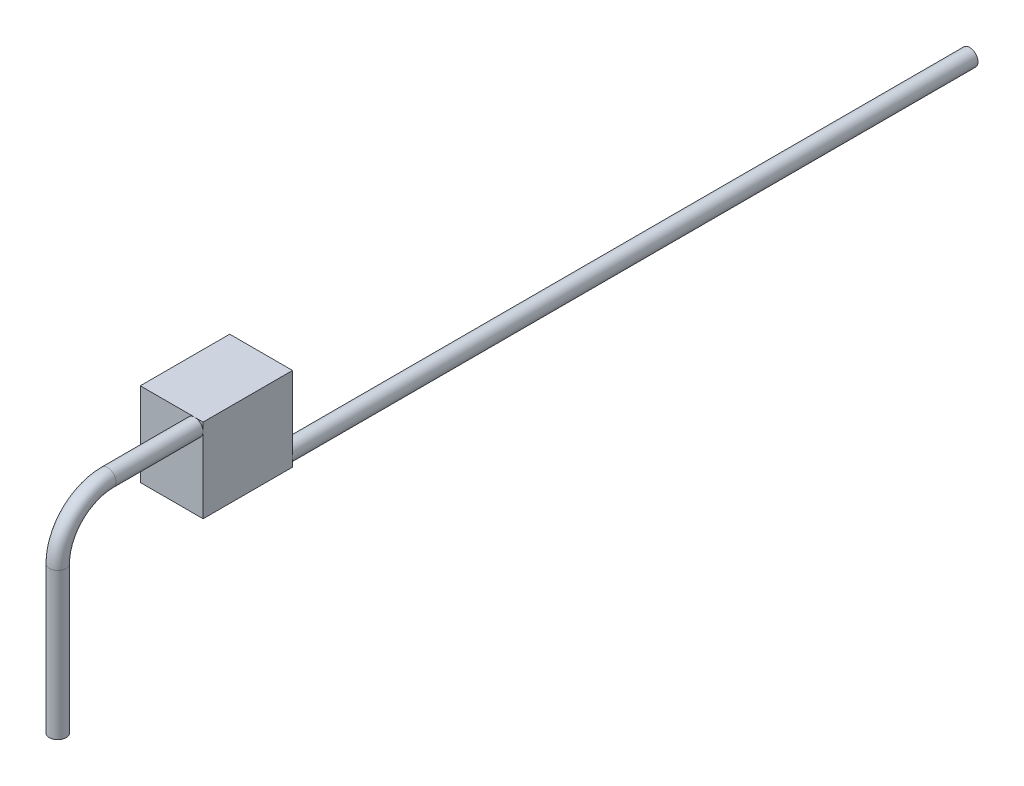
ISO-10303-21;
HEADER;
FILE_DESCRIPTION(('STEP AP214'),'2;1');
FILE_NAME('part.step','',(''),(''),'','','');
FILE_SCHEMA(('AUTOMOTIVE_DESIGN { 1 0 10303 214 1 1 1 1 }'));
ENDSEC;
DATA;
#1=APPLICATION_CONTEXT('core data for automotive mechanical design processes');
#2=APPLICATION_PROTOCOL_DEFINITION('international standard','automotive_design',2000,#1);
#3=PRODUCT_CONTEXT('',#1,'mechanical');
#4=PRODUCT('Part','Part','',(#3));
#5=PRODUCT_RELATED_PRODUCT_CATEGORY('part','',(#4));
#6=PRODUCT_DEFINITION_FORMATION('','',#4);
#7=PRODUCT_DEFINITION_CONTEXT('part definition',#1,'design');
#8=PRODUCT_DEFINITION('design','',#6,#7);
#9=PRODUCT_DEFINITION_SHAPE('','',#8);
#10=(LENGTH_UNIT() NAMED_UNIT(*) SI_UNIT(.MILLI.,.METRE.));
#11=(NAMED_UNIT(*) PLANE_ANGLE_UNIT() SI_UNIT($,.RADIAN.));
#12=(NAMED_UNIT(*) SI_UNIT($,.STERADIAN.) SOLID_ANGLE_UNIT());
#13=UNCERTAINTY_MEASURE_WITH_UNIT(LENGTH_MEASURE(1.E-05),#10,'distance_accuracy_value','');
#14=(GEOMETRIC_REPRESENTATION_CONTEXT(3) GLOBAL_UNCERTAINTY_ASSIGNED_CONTEXT((#13)) GLOBAL_UNIT_ASSIGNED_CONTEXT((#10,
#11,#12)) REPRESENTATION_CONTEXT('',''));
#15=CARTESIAN_POINT('',(0.,0.,0.));
#16=DIRECTION('',(0.,0.,1.));
#17=DIRECTION('',(1.,0.,0.));
#18=AXIS2_PLACEMENT_3D('',#15,#16,#17);
#19=CARTESIAN_POINT('',(0.,0.,185.));
#20=DIRECTION('',(0.,0.,-1.));
#21=DIRECTION('',(-1.,0.,0.));
#22=AXIS2_PLACEMENT_3D('',#19,#20,#21);
#23=PLANE('',#22);
#24=CARTESIAN_POINT('',(0.,16.03125,185.));
#25=DIRECTION('',(0.,0.,1.));
#26=DIRECTION('',(1.,0.,0.));
#27=AXIS2_PLACEMENT_3D('',#24,#25,#26);
#28=CIRCLE('',#27,1.984375);
#29=CARTESIAN_POINT('',(1.984375,16.03125,185.));
#30=VERTEX_POINT('',#29);
#31=CARTESIAN_POINT('',(0.,18.015625,185.));
#32=VERTEX_POINT('',#31);
#33=EDGE_CURVE('E47',#30,#32,#28,.T.);
#34=ORIENTED_EDGE('',*,*,#33,.F.);
#35=DIRECTION('',(0.,1.,0.));
#36=VECTOR('',#35,1.);
#37=CARTESIAN_POINT('',(1.984375,-1.984375,185.));
#38=LINE('',#37,#36);
#39=CARTESIAN_POINT('',(1.984375,18.015625,185.));
#40=VERTEX_POINT('',#39);
#41=EDGE_CURVE('E97',#30,#40,#38,.T.);
#42=ORIENTED_EDGE('',*,*,#41,.T.);
#43=DIRECTION('',(-1.,0.,0.));
#44=VECTOR('',#43,1.);
#45=CARTESIAN_POINT('',(-13.015625,18.015625,185.));
#46=LINE('',#45,#44);
#47=EDGE_CURVE('E108',#40,#32,#46,.T.);
#48=ORIENTED_EDGE('',*,*,#47,.T.);
#49=EDGE_LOOP('',(#34,#42,#48));
#50=FACE_BOUND('',#49,.T.);
#51=ADVANCED_FACE('F36',(#50),#23,.F.);
#52=CARTESIAN_POINT('',(0.,0.,163.65));
#53=DIRECTION('',(0.,0.,-1.));
#54=DIRECTION('',(-1.,0.,0.));
#55=AXIS2_PLACEMENT_3D('',#52,#53,#54);
#56=PLANE('',#55);
#57=CARTESIAN_POINT('',(0.,0.,163.65));
#58=DIRECTION('',(0.,0.,-1.));
#59=DIRECTION('',(-1.,0.,0.));
#60=AXIS2_PLACEMENT_3D('',#57,#58,#59);
#61=CIRCLE('',#60,1.984375);
#62=CARTESIAN_POINT('',(1.984375,0.,163.65));
#63=VERTEX_POINT('',#62);
#64=CARTESIAN_POINT('',(0.,-1.984375,163.65));
#65=VERTEX_POINT('',#64);
#66=EDGE_CURVE('E45',#63,#65,#61,.T.);
#67=ORIENTED_EDGE('',*,*,#66,.F.);
#68=DIRECTION('',(0.,1.,0.));
#69=VECTOR('',#68,1.);
#70=CARTESIAN_POINT('',(1.984375,-1.984375,163.65));
#71=LINE('',#70,#69);
#72=CARTESIAN_POINT('',(1.984375,-1.984375,163.65));
#73=VERTEX_POINT('',#72);
#74=EDGE_CURVE('E60',#73,#63,#71,.T.);
#75=ORIENTED_EDGE('',*,*,#74,.F.);
#76=DIRECTION('',(1.,0.,0.));
#77=VECTOR('',#76,1.);
#78=CARTESIAN_POINT('',(-13.015625,-1.984375,163.65));
#79=LINE('',#78,#77);
#80=EDGE_CURVE('E180',#65,#73,#79,.T.);
#81=ORIENTED_EDGE('',*,*,#80,.F.);
#82=EDGE_LOOP('',(#67,#75,#81));
#83=FACE_BOUND('',#82,.T.);
#84=ADVANCED_FACE('F129',(#83),#56,.T.);
#85=CARTESIAN_POINT('',(-13.015625,-1.984375,163.65));
#86=DIRECTION('',(-1.,0.,0.));
#87=DIRECTION('',(0.,0.,1.));
#88=AXIS2_PLACEMENT_3D('',#85,#86,#87);
#89=PLANE('',#88);
#90=DIRECTION('',(0.,0.,1.));
#91=VECTOR('',#90,1.);
#92=CARTESIAN_POINT('',(-13.015625,-1.984375,163.65));
#93=LINE('',#92,#91);
#94=CARTESIAN_POINT('',(-13.015625,-1.984375,163.65));
#95=VERTEX_POINT('',#94);
#96=CARTESIAN_POINT('',(-13.015625,-1.984375,185.));
#97=VERTEX_POINT('',#96);
#98=EDGE_CURVE('E163',#95,#97,#93,.T.);
#99=ORIENTED_EDGE('',*,*,#98,.T.);
#100=DIRECTION('',(0.,-1.,0.));
#101=VECTOR('',#100,1.);
#102=CARTESIAN_POINT('',(-13.015625,-1.984375,185.));
#103=LINE('',#102,#101);
#104=CARTESIAN_POINT('',(-13.015625,18.015625,185.));
#105=VERTEX_POINT('',#104);
#106=EDGE_CURVE('E164',#105,#97,#103,.T.);
#107=ORIENTED_EDGE('',*,*,#106,.F.);
#108=DIRECTION('',(0.,0.,1.));
#109=VECTOR('',#108,1.);
#110=CARTESIAN_POINT('',(-13.015625,18.015625,163.65));
#111=LINE('',#110,#109);
#112=CARTESIAN_POINT('',(-13.015625,18.015625,163.65));
#113=VERTEX_POINT('',#112);
#114=EDGE_CURVE('E187',#113,#105,#111,.T.);
#115=ORIENTED_EDGE('',*,*,#114,.F.);
#116=DIRECTION('',(0.,-1.,0.));
#117=VECTOR('',#116,1.);
#118=CARTESIAN_POINT('',(-13.015625,-1.984375,163.65));
#119=LINE('',#118,#117);
#120=EDGE_CURVE('E166',#113,#95,#119,.T.);
#121=ORIENTED_EDGE('',*,*,#120,.T.);
#122=EDGE_LOOP('',(#99,#107,#115,#121));
#123=FACE_BOUND('',#122,.T.);
#124=ADVANCED_FACE('F133',(#123),#89,.T.);
#125=CARTESIAN_POINT('',(-13.015625,18.015625,163.65));
#126=DIRECTION('',(0.,1.,0.));
#127=DIRECTION('',(0.,0.,1.));
#128=AXIS2_PLACEMENT_3D('',#125,#126,#127);
#129=PLANE('',#128);
#130=ORIENTED_EDGE('',*,*,#114,.T.);
#131=EDGE_CURVE('E96',#32,#105,#46,.T.);
#132=ORIENTED_EDGE('',*,*,#131,.F.);
#133=ORIENTED_EDGE('',*,*,#47,.F.);
#134=DIRECTION('',(0.,0.,1.));
#135=VECTOR('',#134,1.);
#136=CARTESIAN_POINT('',(1.984375,18.015625,163.65));
#137=LINE('',#136,#135);
#138=CARTESIAN_POINT('',(1.984375,18.015625,163.65));
#139=VERTEX_POINT('',#138);
#140=EDGE_CURVE('E103',#139,#40,#137,.T.);
#141=ORIENTED_EDGE('',*,*,#140,.F.);
#142=DIRECTION('',(-1.,0.,0.));
#143=VECTOR('',#142,1.);
#144=CARTESIAN_POINT('',(-13.015625,18.015625,163.65));
#145=LINE('',#144,#143);
#146=EDGE_CURVE('E170',#139,#113,#145,.T.);
#147=ORIENTED_EDGE('',*,*,#146,.T.);
#148=EDGE_LOOP('',(#130,#132,#133,#141,#147));
#149=FACE_BOUND('',#148,.T.);
#150=ADVANCED_FACE('F151',(#149),#129,.T.);
#151=CARTESIAN_POINT('',(1.984375,-1.984375,163.65));
#152=DIRECTION('',(1.,0.,0.));
#153=DIRECTION('',(0.,0.,-1.));
#154=AXIS2_PLACEMENT_3D('',#151,#152,#153);
#155=PLANE('',#154);
#156=ORIENTED_EDGE('',*,*,#74,.T.);
#157=EDGE_CURVE('E183',#63,#139,#71,.T.);
#158=ORIENTED_EDGE('',*,*,#157,.T.);
#159=ORIENTED_EDGE('',*,*,#140,.T.);
#160=ORIENTED_EDGE('',*,*,#41,.F.);
#161=CARTESIAN_POINT('',(1.984375,-1.984375,185.));
#162=VERTEX_POINT('',#161);
#163=EDGE_CURVE('E90',#162,#30,#38,.T.);
#164=ORIENTED_EDGE('',*,*,#163,.F.);
#165=DIRECTION('',(0.,0.,1.));
#166=VECTOR('',#165,1.);
#167=CARTESIAN_POINT('',(1.984375,-1.984375,163.65));
#168=LINE('',#167,#166);
#169=EDGE_CURVE('E169',#73,#162,#168,.T.);
#170=ORIENTED_EDGE('',*,*,#169,.F.);
#171=EDGE_LOOP('',(#156,#158,#159,#160,#164,#170));
#172=FACE_BOUND('',#171,.T.);
#173=ADVANCED_FACE('F101',(#172),#155,.T.);
#174=CARTESIAN_POINT('',(-13.015625,-1.984375,163.65));
#175=DIRECTION('',(0.,-1.,0.));
#176=DIRECTION('',(0.,0.,-1.));
#177=AXIS2_PLACEMENT_3D('',#174,#175,#176);
#178=PLANE('',#177);
#179=EDGE_CURVE('E181',#95,#65,#79,.T.);
#180=ORIENTED_EDGE('',*,*,#179,.T.);
#181=ORIENTED_EDGE('',*,*,#80,.T.);
#182=ORIENTED_EDGE('',*,*,#169,.T.);
#183=DIRECTION('',(1.,0.,0.));
#184=VECTOR('',#183,1.);
#185=CARTESIAN_POINT('',(-13.015625,-1.984375,185.));
#186=LINE('',#185,#184);
#187=EDGE_CURVE('E95',#97,#162,#186,.T.);
#188=ORIENTED_EDGE('',*,*,#187,.F.);
#189=ORIENTED_EDGE('',*,*,#98,.F.);
#190=EDGE_LOOP('',(#180,#181,#182,#188,#189));
#191=FACE_BOUND('',#190,.T.);
#192=ADVANCED_FACE('F143',(#191),#178,.T.);
#193=EDGE_CURVE('E40',#65,#63,#61,.T.);
#194=ORIENTED_EDGE('',*,*,#193,.F.);
#195=ORIENTED_EDGE('',*,*,#179,.F.);
#196=ORIENTED_EDGE('',*,*,#120,.F.);
#197=ORIENTED_EDGE('',*,*,#146,.F.);
#198=ORIENTED_EDGE('',*,*,#157,.F.);
#199=EDGE_LOOP('',(#194,#195,#196,#197,#198));
#200=FACE_BOUND('',#199,.T.);
#201=ADVANCED_FACE('F136',(#200),#56,.T.);
#202=EDGE_CURVE('E11',#32,#30,#28,.T.);
#203=ORIENTED_EDGE('',*,*,#202,.F.);
#204=ORIENTED_EDGE('',*,*,#131,.T.);
#205=ORIENTED_EDGE('',*,*,#106,.T.);
#206=ORIENTED_EDGE('',*,*,#187,.T.);
#207=ORIENTED_EDGE('',*,*,#163,.T.);
#208=EDGE_LOOP('',(#203,#204,#205,#206,#207));
#209=FACE_BOUND('',#208,.T.);
#210=ADVANCED_FACE('F92',(#209),#23,.F.);
#211=CARTESIAN_POINT('',(0.,0.,170.));
#212=DIRECTION('',(0.,0.,-1.));
#213=DIRECTION('',(-1.,0.,0.));
#214=AXIS2_PLACEMENT_3D('',#211,#212,#213);
#215=CYLINDRICAL_SURFACE('',#214,1.984375);
#216=ORIENTED_EDGE('',*,*,#193,.T.);
#217=ORIENTED_EDGE('',*,*,#66,.T.);
#218=EDGE_LOOP('',(#216,#217));
#219=FACE_BOUND('',#218,.T.);
#220=CARTESIAN_POINT('',(0.,0.,0.));
#221=DIRECTION('',(0.,0.,1.));
#222=DIRECTION('',(1.,0.,0.));
#223=AXIS2_PLACEMENT_3D('',#220,#221,#222);
#224=CIRCLE('',#223,1.984375);
#225=CARTESIAN_POINT('',(1.984375,0.,0.));
#226=VERTEX_POINT('',#225);
#227=EDGE_CURVE('E189',#226,#226,#224,.T.);
#228=ORIENTED_EDGE('',*,*,#227,.T.);
#229=EDGE_LOOP('',(#228));
#230=FACE_BOUND('',#229,.T.);
#231=ADVANCED_FACE('F38',(#219,#230),#215,.T.);
#232=CARTESIAN_POINT('',(0.,0.,0.));
#233=DIRECTION('',(0.,0.,1.));
#234=DIRECTION('',(1.,0.,0.));
#235=AXIS2_PLACEMENT_3D('',#232,#233,#234);
#236=PLANE('',#235);
#237=ORIENTED_EDGE('',*,*,#227,.F.);
#238=EDGE_LOOP('',(#237));
#239=FACE_BOUND('',#238,.T.);
#240=ADVANCED_FACE('F115',(#239),#236,.F.);
#241=CARTESIAN_POINT('',(0.,16.03125,205.799999976));
#242=DIRECTION('',(0.,0.,-1.));
#243=DIRECTION('',(-1.,0.,0.));
#244=AXIS2_PLACEMENT_3D('',#241,#242,#243);
#245=CYLINDRICAL_SURFACE('',#244,1.984375);
#246=CARTESIAN_POINT('',(0.,16.03125,205.799999976));
#247=DIRECTION('',(0.,0.,1.));
#248=DIRECTION('',(1.,0.,0.));
#249=AXIS2_PLACEMENT_3D('',#246,#247,#248);
#250=CIRCLE('',#249,1.984375);
#251=CARTESIAN_POINT('',(0.,18.015625,205.799999976));
#252=VERTEX_POINT('',#251);
#253=EDGE_CURVE('E110',#252,#252,#250,.T.);
#254=ORIENTED_EDGE('',*,*,#253,.F.);
#255=EDGE_LOOP('',(#254));
#256=FACE_BOUND('',#255,.T.);
#257=ORIENTED_EDGE('',*,*,#33,.T.);
#258=ORIENTED_EDGE('',*,*,#202,.T.);
#259=EDGE_LOOP('',(#257,#258));
#260=FACE_BOUND('',#259,.T.);
#261=ADVANCED_FACE('F112',(#256,#260),#245,.T.);
#262=CARTESIAN_POINT('',(0.,4.11299218058577,205.799999976));
#263=DIRECTION('',(-1.,0.,0.));
#264=DIRECTION('',(0.,0.,1.));
#265=AXIS2_PLACEMENT_3D('',#262,#263,#264);
#266=TOROIDAL_SURFACE('',#265,11.9182578194142,1.984375);
#267=CARTESIAN_POINT('',(0.,4.11299218058572,217.718257795414));
#268=DIRECTION('',(0.,-1.,0.));
#269=DIRECTION('',(1.,0.,0.));
#270=AXIS2_PLACEMENT_3D('',#267,#268,#269);
#271=CIRCLE('',#270,1.984375);
#272=CARTESIAN_POINT('',(0.,4.11299218058571,219.702632795414));
#273=VERTEX_POINT('',#272);
#274=EDGE_CURVE('E111',#273,#273,#271,.T.);
#275=CARTESIAN_POINT('',(0.,4.11299218058577,205.799999976));
#276=DIRECTION('',(-1.,0.,0.));
#277=DIRECTION('',(0.,0.,1.));
#278=AXIS2_PLACEMENT_3D('',#275,#276,#277);
#279=CIRCLE('',#278,13.9026328194142);
#280=EDGE_CURVE('',#273,#252,#279,.T.);
#281=ORIENTED_EDGE('',*,*,#274,.F.);
#282=ORIENTED_EDGE('',*,*,#253,.T.);
#283=ORIENTED_EDGE('',*,*,#280,.T.);
#284=ORIENTED_EDGE('',*,*,#280,.F.);
#285=EDGE_LOOP('',(#281,#283,#282,#284));
#286=FACE_BOUND('',#285,.T.);
#287=ADVANCED_FACE('F114',(#286),#266,.T.);
#288=CARTESIAN_POINT('',(0.,-30.8870078574143,217.718257795414));
#289=DIRECTION('',(0.,1.,0.));
#290=DIRECTION('',(0.,0.,1.));
#291=AXIS2_PLACEMENT_3D('',#288,#289,#290);
#292=CYLINDRICAL_SURFACE('',#291,1.98437500000003);
#293=CARTESIAN_POINT('',(0.,-30.8870078574143,217.718257795414));
#294=DIRECTION('',(0.,-1.,0.));
#295=DIRECTION('',(0.,0.,-1.));
#296=AXIS2_PLACEMENT_3D('',#293,#294,#295);
#297=CIRCLE('',#296,1.98437500000003);
#298=CARTESIAN_POINT('',(0.,-30.8870078574143,215.733882795414));
#299=VERTEX_POINT('',#298);
#300=EDGE_CURVE('E202',#299,#299,#297,.T.);
#301=ORIENTED_EDGE('',*,*,#300,.F.);
#302=EDGE_LOOP('',(#301));
#303=FACE_BOUND('',#302,.T.);
#304=ORIENTED_EDGE('',*,*,#274,.T.);
#305=EDGE_LOOP('',(#304));
#306=FACE_BOUND('',#305,.T.);
#307=ADVANCED_FACE('F122',(#303,#306),#292,.T.);
#308=CARTESIAN_POINT('',(0.,-30.8870078574143,217.718257795414));
#309=DIRECTION('',(0.,-1.,0.));
#310=DIRECTION('',(0.,0.,-1.));
#311=AXIS2_PLACEMENT_3D('',#308,#309,#310);
#312=PLANE('',#311);
#313=ORIENTED_EDGE('',*,*,#300,.T.);
#314=EDGE_LOOP('',(#313));
#315=FACE_BOUND('',#314,.T.);
#316=ADVANCED_FACE('F206',(#315),#312,.T.);
#317=CLOSED_SHELL('',(#51,#84,#124,#150,#173,#192,#201,#210,#231,#240,#261,#287,#307,#316));
#318=MANIFOLD_SOLID_BREP('B2',#317);
#319=ADVANCED_BREP_SHAPE_REPRESENTATION('',(#18,#318),#14);
#320=SHAPE_DEFINITION_REPRESENTATION(#9,#319);
ENDSEC;
END-ISO-10303-21;
